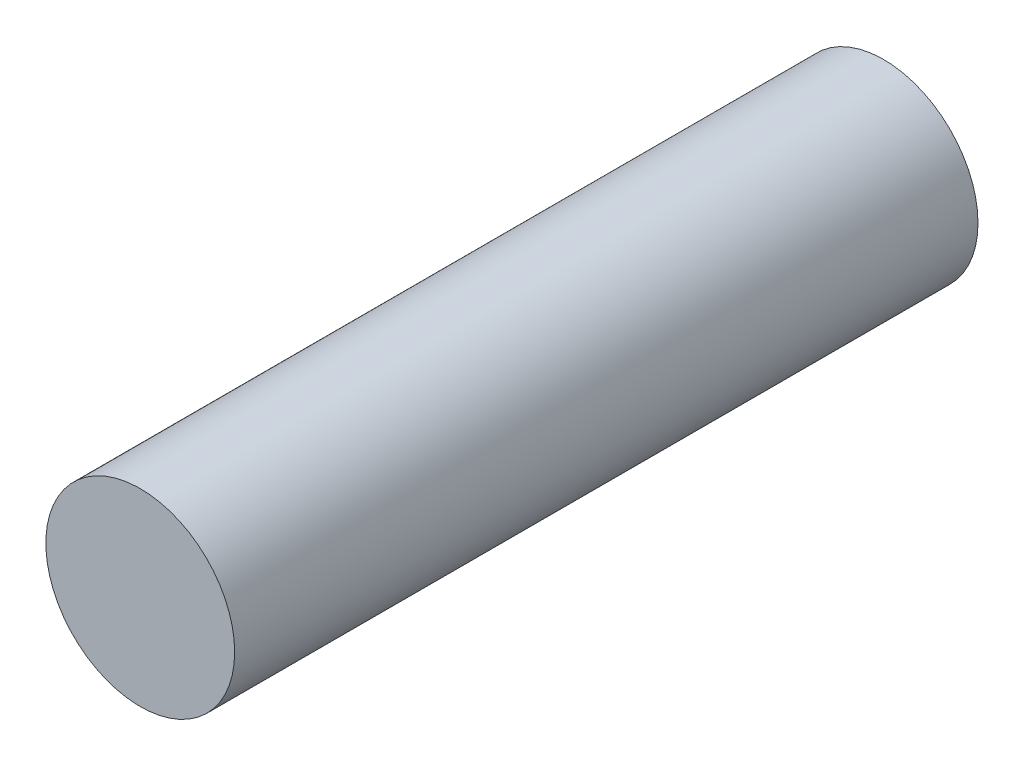
ISO-10303-21;
HEADER;
FILE_DESCRIPTION(('STEP AP214'),'2;1');
FILE_NAME('part.step','',(''),(''),'','','');
FILE_SCHEMA(('AUTOMOTIVE_DESIGN { 1 0 10303 214 1 1 1 1 }'));
ENDSEC;
DATA;
#1=APPLICATION_CONTEXT('core data for automotive mechanical design processes');
#2=APPLICATION_PROTOCOL_DEFINITION('international standard','automotive_design',2000,#1);
#3=PRODUCT_CONTEXT('',#1,'mechanical');
#4=PRODUCT('Part','Part','',(#3));
#5=PRODUCT_RELATED_PRODUCT_CATEGORY('part','',(#4));
#6=PRODUCT_DEFINITION_FORMATION('','',#4);
#7=PRODUCT_DEFINITION_CONTEXT('part definition',#1,'design');
#8=PRODUCT_DEFINITION('design','',#6,#7);
#9=PRODUCT_DEFINITION_SHAPE('','',#8);
#10=(LENGTH_UNIT() NAMED_UNIT(*) SI_UNIT(.MILLI.,.METRE.));
#11=(NAMED_UNIT(*) PLANE_ANGLE_UNIT() SI_UNIT($,.RADIAN.));
#12=(NAMED_UNIT(*) SI_UNIT($,.STERADIAN.) SOLID_ANGLE_UNIT());
#13=UNCERTAINTY_MEASURE_WITH_UNIT(LENGTH_MEASURE(1.E-05),#10,'distance_accuracy_value','');
#14=(GEOMETRIC_REPRESENTATION_CONTEXT(3) GLOBAL_UNCERTAINTY_ASSIGNED_CONTEXT((#13)) GLOBAL_UNIT_ASSIGNED_CONTEXT((#10,
#11,#12)) REPRESENTATION_CONTEXT('',''));
#15=CARTESIAN_POINT('',(0.,0.,0.));
#16=DIRECTION('',(0.,0.,1.));
#17=DIRECTION('',(1.,0.,0.));
#18=AXIS2_PLACEMENT_3D('',#15,#16,#17);
#19=CARTESIAN_POINT('',(0.,0.,100.));
#20=DIRECTION('',(0.,0.,-1.));
#21=DIRECTION('',(-1.,0.,0.));
#22=AXIS2_PLACEMENT_3D('',#19,#20,#21);
#23=CYLINDRICAL_SURFACE('',#22,12.7);
#24=CARTESIAN_POINT('',(0.,0.,100.));
#25=DIRECTION('',(0.,0.,1.));
#26=DIRECTION('',(1.,0.,0.));
#27=AXIS2_PLACEMENT_3D('',#24,#25,#26);
#28=CIRCLE('',#27,12.7);
#29=CARTESIAN_POINT('',(12.7,0.,100.));
#30=VERTEX_POINT('',#29);
#31=EDGE_CURVE('E10',#30,#30,#28,.T.);
#32=ORIENTED_EDGE('',*,*,#31,.F.);
#33=EDGE_LOOP('',(#32));
#34=FACE_BOUND('',#33,.T.);
#35=CARTESIAN_POINT('',(0.,0.,0.));
#36=DIRECTION('',(0.,0.,1.));
#37=DIRECTION('',(1.,0.,0.));
#38=AXIS2_PLACEMENT_3D('',#35,#36,#37);
#39=CIRCLE('',#38,12.7);
#40=CARTESIAN_POINT('',(12.7,0.,0.));
#41=VERTEX_POINT('',#40);
#42=EDGE_CURVE('E34',#41,#41,#39,.T.);
#43=ORIENTED_EDGE('',*,*,#42,.T.);
#44=EDGE_LOOP('',(#43));
#45=FACE_BOUND('',#44,.T.);
#46=ADVANCED_FACE('F31',(#34,#45),#23,.T.);
#47=CARTESIAN_POINT('',(0.,0.,100.));
#48=DIRECTION('',(0.,0.,1.));
#49=DIRECTION('',(1.,0.,0.));
#50=AXIS2_PLACEMENT_3D('',#47,#48,#49);
#51=PLANE('',#50);
#52=ORIENTED_EDGE('',*,*,#31,.T.);
#53=EDGE_LOOP('',(#52));
#54=FACE_BOUND('',#53,.T.);
#55=ADVANCED_FACE('F46',(#54),#51,.T.);
#56=CARTESIAN_POINT('',(0.,0.,0.));
#57=DIRECTION('',(0.,0.,1.));
#58=DIRECTION('',(1.,0.,0.));
#59=AXIS2_PLACEMENT_3D('',#56,#57,#58);
#60=PLANE('',#59);
#61=ORIENTED_EDGE('',*,*,#42,.F.);
#62=EDGE_LOOP('',(#61));
#63=FACE_BOUND('',#62,.T.);
#64=ADVANCED_FACE('F44',(#63),#60,.F.);
#65=CLOSED_SHELL('',(#46,#55,#64));
#66=MANIFOLD_SOLID_BREP('B2',#65);
#67=ADVANCED_BREP_SHAPE_REPRESENTATION('',(#18,#66),#14);
#68=SHAPE_DEFINITION_REPRESENTATION(#9,#67);
ENDSEC;
END-ISO-10303-21;
